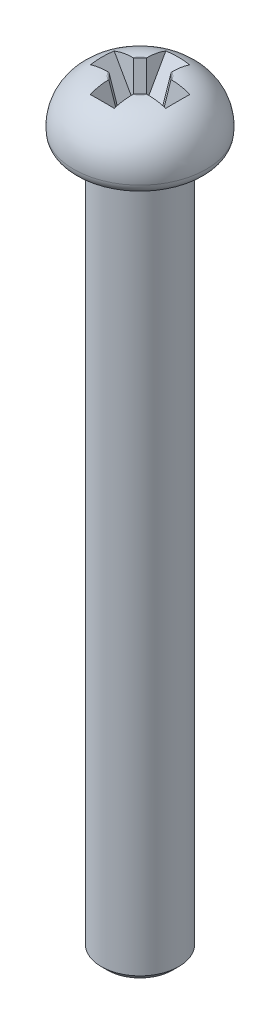
ISO-10303-21;
HEADER;
FILE_DESCRIPTION(('STEP AP214'),'2;1');
FILE_NAME('part.step','',(''),(''),'','','');
FILE_SCHEMA(('AUTOMOTIVE_DESIGN { 1 0 10303 214 1 1 1 1 }'));
ENDSEC;
DATA;
#1=APPLICATION_CONTEXT('core data for automotive mechanical design processes');
#2=APPLICATION_PROTOCOL_DEFINITION('international standard','automotive_design',2000,#1);
#3=PRODUCT_CONTEXT('',#1,'mechanical');
#4=PRODUCT('Part','Part','',(#3));
#5=PRODUCT_RELATED_PRODUCT_CATEGORY('part','',(#4));
#6=PRODUCT_DEFINITION_FORMATION('','',#4);
#7=PRODUCT_DEFINITION_CONTEXT('part definition',#1,'design');
#8=PRODUCT_DEFINITION('design','',#6,#7);
#9=PRODUCT_DEFINITION_SHAPE('','',#8);
#10=(LENGTH_UNIT() NAMED_UNIT(*) SI_UNIT(.MILLI.,.METRE.));
#11=(NAMED_UNIT(*) PLANE_ANGLE_UNIT() SI_UNIT($,.RADIAN.));
#12=(NAMED_UNIT(*) SI_UNIT($,.STERADIAN.) SOLID_ANGLE_UNIT());
#13=UNCERTAINTY_MEASURE_WITH_UNIT(LENGTH_MEASURE(1.E-05),#10,'distance_accuracy_value','');
#14=(GEOMETRIC_REPRESENTATION_CONTEXT(3) GLOBAL_UNCERTAINTY_ASSIGNED_CONTEXT((#13)) GLOBAL_UNIT_ASSIGNED_CONTEXT((#10,
#11,#12)) REPRESENTATION_CONTEXT('',''));
#15=CARTESIAN_POINT('',(0.,0.,0.));
#16=DIRECTION('',(0.,0.,1.));
#17=DIRECTION('',(1.,0.,0.));
#18=AXIS2_PLACEMENT_3D('',#15,#16,#17);
#19=CARTESIAN_POINT('',(0.,23.1,0.));
#20=DIRECTION('',(0.,1.,0.));
#21=DIRECTION('',(-1.,0.,0.));
#22=AXIS2_PLACEMENT_3D('',#19,#20,#21);
#23=DEGENERATE_TOROIDAL_SURFACE('',#22,0.75,1.4,.T.);
#24=CARTESIAN_POINT('',(0.,22.96,0.));
#25=DIRECTION('',(0.,1.,0.));
#26=DIRECTION('',(-1.,0.,0.));
#27=AXIS2_PLACEMENT_3D('',#24,#25,#26);
#28=CIRCLE('',#27,2.14298241194927);
#29=CARTESIAN_POINT('',(-2.14298241194927,22.96,0.));
#30=VERTEX_POINT('',#29);
#31=EDGE_CURVE('E418',#30,#30,#28,.T.);
#32=ORIENTED_EDGE('',*,*,#31,.T.);
#33=EDGE_LOOP('',(#32));
#34=FACE_BOUND('',#33,.T.);
#35=CARTESIAN_POINT('',(0.,24.5,0.));
#36=DIRECTION('',(0.,1.,0.));
#37=DIRECTION('',(-1.,0.,0.));
#38=AXIS2_PLACEMENT_3D('',#35,#36,#37);
#39=CIRCLE('',#38,0.75);
#40=CARTESIAN_POINT('',(0.634428877022475,24.5,-0.400000000000002));
#41=VERTEX_POINT('',#40);
#42=CARTESIAN_POINT('',(0.4,24.5,-0.634428877024973));
#43=VERTEX_POINT('',#42);
#44=EDGE_CURVE('E404',#41,#43,#39,.T.);
#45=ORIENTED_EDGE('',*,*,#44,.F.);
#46=CARTESIAN_POINT('',(-1.3003,24.3626261732546,-0.380375167607794));
#47=CARTESIAN_POINT('',(-1.26089007728644,24.3804122910174,-0.382916041573912));
#48=CARTESIAN_POINT('',(-1.22069162793174,24.3964665213125,-0.385209503044639));
#49=CARTESIAN_POINT('',(-1.13908686700963,24.4250738129891,-0.389296258998438));
#50=CARTESIAN_POINT('',(-1.09768180130337,24.437630353562,-0.391090050508854));
#51=CARTESIAN_POINT('',(-1.0150378123073,24.4589604861164,-0.394137212302335));
#52=CARTESIAN_POINT('',(-0.973822385569127,24.4678236725183,-0.39540338178832));
#53=CARTESIAN_POINT('',(-0.890808141225857,24.4822874948652,-0.397469642123594));
#54=CARTESIAN_POINT('',(-0.849009189432539,24.4878873672845,-0.398269623897777));
#55=CARTESIAN_POINT('',(-0.750413146051571,24.4973555137272,-0.399622216246743));
#56=CARTESIAN_POINT('',(-0.693486317549514,24.4999320449846,-0.39999029214065));
#57=CARTESIAN_POINT('',(-0.608111696236459,24.5000322209244,-0.400004602989195));
#58=CARTESIAN_POINT('',(-0.579643164790398,24.499437049158,-0.399919578451141));
#59=CARTESIAN_POINT('',(-0.522752680185501,24.4971502482129,-0.399592892601835));
#60=CARTESIAN_POINT('',(-0.49433072277346,24.4954587254754,-0.399351246496488));
#61=CARTESIAN_POINT('',(-0.437027740461401,24.4911545469416,-0.398736363848798));
#62=CARTESIAN_POINT('',(-0.408148058124476,24.4885252741714,-0.39836075345306));
#63=CARTESIAN_POINT('',(-0.350439729486661,24.4826832236423,-0.397526174806036));
#64=CARTESIAN_POINT('',(-0.321611108665827,24.4794702094213,-0.397067172774473));
#65=CARTESIAN_POINT('',(-0.264048008426549,24.4729448191823,-0.396134974168897));
#66=CARTESIAN_POINT('',(-0.235313491540051,24.4696327467615,-0.395661820965933));
#67=CARTESIAN_POINT('',(-0.17781808924954,24.4635375284767,-0.394791075496667));
#68=CARTESIAN_POINT('',(-0.149057277636777,24.4607537484653,-0.3943933926379));
#69=CARTESIAN_POINT('',(-0.0905703317910267,24.4563641096998,-0.39376630138569));
#70=CARTESIAN_POINT('',(-0.0608409930125525,24.454795863324,-0.393542266189139));
#71=CARTESIAN_POINT('',(-0.00134528484497124,24.4535218718516,-0.39336026740737));
#72=CARTESIAN_POINT('',(0.0284210707204119,24.4538155668265,-0.393402223832362));
#73=CARTESIAN_POINT('',(0.0879515734934974,24.4561575564786,-0.393736793782651));
#74=CARTESIAN_POINT('',(0.117715515237976,24.4582103943596,-0.394030056337091));
#75=CARTESIAN_POINT('',(0.177148617663195,24.4634038446307,-0.394771977804382));
#76=CARTESIAN_POINT('',(0.206817733981497,24.4665449072044,-0.395220701029198));
#77=CARTESIAN_POINT('',(0.266166782746956,24.4731383852877,-0.396162626469666));
#78=CARTESIAN_POINT('',(0.295846655084594,24.4765912961258,-0.396655899446544));
#79=CARTESIAN_POINT('',(0.355237360185876,24.4831693402262,-0.397595620032309));
#80=CARTESIAN_POINT('',(0.384948182602501,24.4862945605132,-0.398042080073309));
#81=CARTESIAN_POINT('',(0.444392003324856,24.4917606922595,-0.398822956037075));
#82=CARTESIAN_POINT('',(0.474124858325947,24.4941030474649,-0.399157578209268));
#83=CARTESIAN_POINT('',(0.533656079386098,24.4977057923504,-0.399672256050055));
#84=CARTESIAN_POINT('',(0.563454442779347,24.4989662252703,-0.399852317895754));
#85=CARTESIAN_POINT('',(0.652518321779543,24.5007832672825,-0.400111895326074));
#86=CARTESIAN_POINT('',(0.711846078503662,24.4994180674973,-0.399916866785334));
#87=CARTESIAN_POINT('',(0.830130248041174,24.4905767975484,-0.398653828221197));
#88=CARTESIAN_POINT('',(0.889086074613947,24.4830927480587,-0.3975846782941));
#89=CARTESIAN_POINT('',(1.00818018951245,24.4611596619974,-0.394451380285342));
#90=CARTESIAN_POINT('',(1.06826824121651,24.4464383162736,-0.392348330896228));
#91=CARTESIAN_POINT('',(1.18620618717689,24.4098804005745,-0.387125771510653));
#92=CARTESIAN_POINT('',(1.24405541021776,24.388041714981,-0.384005959283004));
#93=CARTESIAN_POINT('',(1.3003,24.3626261732546,-0.380375167607803));
#94=B_SPLINE_CURVE_WITH_KNOTS('',3,(#46,#47,#48,#49,#50,#51,#52,#53,#54,#55,#56,#57,#58,#59,#60,
#61,#62,#63,#64,#65,#66,#67,#68,#69,#70,#71,#72,#73,#74,#75,#76,#77,#78,#79,#80,#81,#82,#83,#84,
#85,#86,#87,#88,#89,#90,#91,#92,#93),.UNSPECIFIED.,.F.,.F.,(4,2,2,2,2,2,2,2,2,2,2,2,2,2,2,2,2,2,
2,2,2,2,2,4),(0.,0.129882661764058,0.259635662633353,0.386026440923431,0.512446779319048,
0.683107501657639,0.768515489142608,0.853915185871134,0.940910193949357,1.02794052084929,
1.11472701876279,1.20140867239522,1.29067590426618,1.37991629270354,1.46938785248041,
1.55889646970851,1.64854984727201,1.73817935495753,1.82764264548264,1.91710236038141,
2.09483807436349,2.27280593614925,2.45805157898703,2.6433523361058),.UNSPECIFIED.);
#95=CARTESIAN_POINT('',(1.21872132087533,24.3965544083868,-0.385222058340974));
#96=VERTEX_POINT('',#95);
#97=EDGE_CURVE('E531',#41,#96,#94,.T.);
#98=ORIENTED_EDGE('',*,*,#97,.T.);
#99=CARTESIAN_POINT('',(1.21758280761715,24.3951053915127,0.400299999999995));
#100=CARTESIAN_POINT('',(1.22268436967021,24.4015982886712,0.333794911276537));
#101=CARTESIAN_POINT('',(1.22643888664972,24.4063767648269,0.267039035884157));
#102=CARTESIAN_POINT('',(1.23138366522483,24.4126701193771,0.13352149792124));
#103=CARTESIAN_POINT('',(1.23258325242981,24.4141968667289,0.0667607489606173));
#104=CARTESIAN_POINT('',(1.23258325242981,24.4141968667289,-0.0667607489606272));
#105=CARTESIAN_POINT('',(1.23138366522483,24.4126701193771,-0.133521497921249));
#106=CARTESIAN_POINT('',(1.22643888664972,24.4063767648269,-0.267039035884167));
#107=CARTESIAN_POINT('',(1.2226843696702,24.4015982886712,-0.333794911276547));
#108=CARTESIAN_POINT('',(1.21758280761715,24.3951053915127,-0.400300000000005));
#109=B_SPLINE_CURVE_WITH_KNOTS('',3,(#99,#100,#101,#102,#103,#104,#105,#106,#107,#108),
.UNSPECIFIED.,.F.,.F.,(4,2,2,2,4),(0.,0.200980856434186,0.40122685746795,0.601472858501713,
0.802453714935899),.UNSPECIFIED.);
#110=CARTESIAN_POINT('',(1.21872132087533,24.3965544083868,0.385222058340965));
#111=VERTEX_POINT('',#110);
#112=EDGE_CURVE('E522',#111,#96,#109,.T.);
#113=ORIENTED_EDGE('',*,*,#112,.F.);
#114=CARTESIAN_POINT('',(1.3003,24.3626261732546,0.380375167607794));
#115=CARTESIAN_POINT('',(1.26089007728643,24.3804122910174,0.382916041573911));
#116=CARTESIAN_POINT('',(1.22069162793174,24.3964665213125,0.385209503044639));
#117=CARTESIAN_POINT('',(1.13908686700963,24.4250738129891,0.389296258998437));
#118=CARTESIAN_POINT('',(1.09768180130337,24.437630353562,0.391090050508854));
#119=CARTESIAN_POINT('',(1.0150378123073,24.4589604861164,0.394137212302334));
#120=CARTESIAN_POINT('',(0.973822385569129,24.4678236725183,0.395403381788319));
#121=CARTESIAN_POINT('',(0.89080814122586,24.4822874948652,0.397469642123592));
#122=CARTESIAN_POINT('',(0.849009189432542,24.4878873672845,0.398269623897776));
#123=CARTESIAN_POINT('',(0.750413146051575,24.4973555137272,0.399622216246743));
#124=CARTESIAN_POINT('',(0.693486317549516,24.4999320449846,0.399990292140649));
#125=CARTESIAN_POINT('',(0.60811169623646,24.5000322209244,0.400004602989195));
#126=CARTESIAN_POINT('',(0.579643164790399,24.499437049158,0.39991957845114));
#127=CARTESIAN_POINT('',(0.522752680185501,24.4971502482129,0.399592892601834));
#128=CARTESIAN_POINT('',(0.49433072277346,24.4954587254754,0.399351246496487));
#129=CARTESIAN_POINT('',(0.4370277404614,24.4911545469416,0.398736363848797));
#130=CARTESIAN_POINT('',(0.408148058124473,24.4885252741714,0.39836075345306));
#131=CARTESIAN_POINT('',(0.350439729486657,24.4826832236423,0.397526174806036));
#132=CARTESIAN_POINT('',(0.321611108665823,24.4794702094213,0.397067172774473));
#133=CARTESIAN_POINT('',(0.264048008426544,24.4729448191823,0.396134974168897));
#134=CARTESIAN_POINT('',(0.235313491540045,24.4696327467615,0.395661820965933));
#135=CARTESIAN_POINT('',(0.177818089249534,24.4635375284767,0.394791075496667));
#136=CARTESIAN_POINT('',(0.14905727763677,24.4607537484653,0.3943933926379));
#137=CARTESIAN_POINT('',(0.0905703317910196,24.4563641096998,0.393766301385689));
#138=CARTESIAN_POINT('',(0.0608409930125457,24.454795863324,0.393542266189138));
#139=CARTESIAN_POINT('',(0.00134528484496484,24.4535218718516,0.39336026740737));
#140=CARTESIAN_POINT('',(-0.0284210707204181,24.4538155668265,0.393402223832361));
#141=CARTESIAN_POINT('',(-0.0879515734935034,24.4561575564786,0.393736793782651));
#142=CARTESIAN_POINT('',(-0.117715515237982,24.4582103943596,0.394030056337091));
#143=CARTESIAN_POINT('',(-0.177148617663201,24.4634038446307,0.394771977804381));
#144=CARTESIAN_POINT('',(-0.206817733981503,24.4665449072044,0.395220701029197));
#145=CARTESIAN_POINT('',(-0.266166782746961,24.4731383852877,0.396162626469665));
#146=CARTESIAN_POINT('',(-0.2958466550846,24.4765912961258,0.396655899446543));
#147=CARTESIAN_POINT('',(-0.355237360185881,24.4831693402262,0.397595620032309));
#148=CARTESIAN_POINT('',(-0.384948182602506,24.4862945605132,0.398042080073309));
#149=CARTESIAN_POINT('',(-0.44439200332486,24.4917606922595,0.398822956037074));
#150=CARTESIAN_POINT('',(-0.474124858325951,24.4941030474649,0.399157578209267));
#151=CARTESIAN_POINT('',(-0.533656079386102,24.4977057923504,0.399672256050054));
#152=CARTESIAN_POINT('',(-0.563454442779351,24.4989662252703,0.399852317895753));
#153=CARTESIAN_POINT('',(-0.652518321779546,24.5007832672825,0.400111895326074));
#154=CARTESIAN_POINT('',(-0.711846078503665,24.4994180674973,0.399916866785333));
#155=CARTESIAN_POINT('',(-0.830130248041177,24.4905767975484,0.398653828221196));
#156=CARTESIAN_POINT('',(-0.88908607461395,24.4830927480587,0.3975846782941));
#157=CARTESIAN_POINT('',(-1.00818018951245,24.4611596619974,0.394451380285341));
#158=CARTESIAN_POINT('',(-1.06826824121651,24.4464383162736,0.392348330896227));
#159=CARTESIAN_POINT('',(-1.18620618717689,24.4098804005745,0.387125771510651));
#160=CARTESIAN_POINT('',(-1.24405541021776,24.388041714981,0.384005959283003));
#161=CARTESIAN_POINT('',(-1.3003,24.3626261732546,0.380375167607802));
#162=B_SPLINE_CURVE_WITH_KNOTS('',3,(#114,#115,#116,#117,#118,#119,#120,#121,#122,#123,#124,
#125,#126,#127,#128,#129,#130,#131,#132,#133,#134,#135,#136,#137,#138,#139,#140,#141,#142,#143,
#144,#145,#146,#147,#148,#149,#150,#151,#152,#153,#154,#155,#156,#157,#158,#159,#160,#161),
.UNSPECIFIED.,.F.,.F.,(4,2,2,2,2,2,2,2,2,2,2,2,2,2,2,2,2,2,2,2,2,2,2,4),(0.,0.129882661764057,
0.259635662633351,0.386026440923427,0.512446779319042,0.683107501657636,0.768515489142607,
0.853915185871135,0.940910193949359,1.0279405208493,1.1147270187628,1.20140867239523,
1.29067590426619,1.37991629270355,1.46938785248042,1.55889646970851,1.64854984727201,
1.73817935495753,1.82764264548264,1.91710236038142,2.09483807436349,2.27280593614925,
2.45805157898703,2.6433523361058),.UNSPECIFIED.);
#163=CARTESIAN_POINT('',(0.634428877022478,24.5,0.399999999999998));
#164=VERTEX_POINT('',#163);
#165=EDGE_CURVE('E469',#111,#164,#162,.T.);
#166=ORIENTED_EDGE('',*,*,#165,.T.);
#167=CARTESIAN_POINT('',(0.399999999999999,24.5,0.634428877021819));
#168=VERTEX_POINT('',#167);
#169=EDGE_CURVE('E412',#168,#164,#39,.T.);
#170=ORIENTED_EDGE('',*,*,#169,.F.);
#171=CARTESIAN_POINT('',(0.380375167607798,24.3626261732546,-1.3003));
#172=CARTESIAN_POINT('',(0.382916041573916,24.3804122910174,-1.26089007728643));
#173=CARTESIAN_POINT('',(0.385209503044644,24.3964665213125,-1.22069162793174));
#174=CARTESIAN_POINT('',(0.389296258998442,24.4250738129891,-1.13908686700963));
#175=CARTESIAN_POINT('',(0.391090050508857,24.437630353562,-1.09768180130337));
#176=CARTESIAN_POINT('',(0.394137212302338,24.4589604861164,-1.0150378123073));
#177=CARTESIAN_POINT('',(0.395403381788323,24.4678236725183,-0.973822385569125));
#178=CARTESIAN_POINT('',(0.397469642123596,24.4822874948652,-0.890808141225855));
#179=CARTESIAN_POINT('',(0.398269623897779,24.4878873672845,-0.849009189432537));
#180=CARTESIAN_POINT('',(0.399622216246745,24.4973555137272,-0.750413146051569));
#181=CARTESIAN_POINT('',(0.399990292140652,24.4999320449846,-0.693486317549512));
#182=CARTESIAN_POINT('',(0.400004602989198,24.5000322209244,-0.608111696236457));
#183=CARTESIAN_POINT('',(0.399919578451143,24.499437049158,-0.579643164790396));
#184=CARTESIAN_POINT('',(0.399592892601837,24.4971502482129,-0.5227526801855));
#185=CARTESIAN_POINT('',(0.39935124649649,24.4954587254754,-0.494330722773459));
#186=CARTESIAN_POINT('',(0.398736363848799,24.4911545469416,-0.4370277404614));
#187=CARTESIAN_POINT('',(0.398360753453061,24.4885252741714,-0.408148058124474));
#188=CARTESIAN_POINT('',(0.397526174806037,24.4826832236423,-0.350439729486659));
#189=CARTESIAN_POINT('',(0.397067172774475,24.4794702094213,-0.321611108665825));
#190=CARTESIAN_POINT('',(0.396134974168899,24.4729448191823,-0.264048008426547));
#191=CARTESIAN_POINT('',(0.395661820965934,24.4696327467615,-0.235313491540049));
#192=CARTESIAN_POINT('',(0.394791075496668,24.4635375284767,-0.177818089249539));
#193=CARTESIAN_POINT('',(0.394393392637901,24.4607537484653,-0.149057277636776));
#194=CARTESIAN_POINT('',(0.39376630138569,24.4563641096998,-0.0905703317910256));
#195=CARTESIAN_POINT('',(0.393542266189139,24.454795863324,-0.0608409930125514));
#196=CARTESIAN_POINT('',(0.39336026740737,24.4535218718516,-0.00134528484497017));
#197=CARTESIAN_POINT('',(0.393402223832362,24.4538155668265,0.028421070720413));
#198=CARTESIAN_POINT('',(0.393736793782651,24.4561575564786,0.0879515734934985));
#199=CARTESIAN_POINT('',(0.394030056337091,24.4582103943596,0.117715515237977));
#200=CARTESIAN_POINT('',(0.394771977804381,24.4634038446307,0.177148617663196));
#201=CARTESIAN_POINT('',(0.395220701029197,24.4665449072044,0.206817733981498));
#202=CARTESIAN_POINT('',(0.396162626469665,24.4731383852877,0.266166782746957));
#203=CARTESIAN_POINT('',(0.396655899446543,24.4765912961258,0.295846655084596));
#204=CARTESIAN_POINT('',(0.397595620032308,24.4831693402262,0.355237360185877));
#205=CARTESIAN_POINT('',(0.398042080073308,24.4862945605132,0.384948182602502));
#206=CARTESIAN_POINT('',(0.398822956037074,24.4917606922595,0.444392003324857));
#207=CARTESIAN_POINT('',(0.399157578209267,24.4941030474649,0.474124858325948));
#208=CARTESIAN_POINT('',(0.399672256050053,24.4977057923504,0.533656079386099));
#209=CARTESIAN_POINT('',(0.399852317895752,24.4989662252703,0.563454442779348));
#210=CARTESIAN_POINT('',(0.400111895326072,24.5007832672825,0.652518321779544));
#211=CARTESIAN_POINT('',(0.399916866785332,24.4994180674973,0.711846078503663));
#212=CARTESIAN_POINT('',(0.398653828221194,24.4905767975484,0.830130248041175));
#213=CARTESIAN_POINT('',(0.397584678294097,24.4830927480587,0.889086074613948));
#214=CARTESIAN_POINT('',(0.394451380285338,24.4611596619974,1.00818018951245));
#215=CARTESIAN_POINT('',(0.392348330896224,24.4464383162736,1.06826824121651));
#216=CARTESIAN_POINT('',(0.387125771510649,24.4098804005745,1.18620618717689));
#217=CARTESIAN_POINT('',(0.384005959283,24.388041714981,1.24405541021776));
#218=CARTESIAN_POINT('',(0.380375167607799,24.3626261732546,1.3003));
#219=B_SPLINE_CURVE_WITH_KNOTS('',3,(#171,#172,#173,#174,#175,#176,#177,#178,#179,#180,#181,
#182,#183,#184,#185,#186,#187,#188,#189,#190,#191,#192,#193,#194,#195,#196,#197,#198,#199,#200,
#201,#202,#203,#204,#205,#206,#207,#208,#209,#210,#211,#212,#213,#214,#215,#216,#217,#218),
.UNSPECIFIED.,.F.,.F.,(4,2,2,2,2,2,2,2,2,2,2,2,2,2,2,2,2,2,2,2,2,2,2,4),(0.,0.129882661764059,
0.259635662633354,0.386026440923432,0.512446779319048,0.683107501657639,0.768515489142608,
0.853915185871134,0.940910193949357,1.02794052084929,1.11472701876279,1.20140867239522,
1.29067590426618,1.37991629270354,1.46938785248041,1.55889646970851,1.64854984727201,
1.73817935495753,1.82764264548264,1.91710236038142,2.09483807436349,2.27280593614925,
2.45805157898703,2.6433523361058),.UNSPECIFIED.);
#220=CARTESIAN_POINT('',(0.38522205834097,24.3965544083868,1.21872132087533));
#221=VERTEX_POINT('',#220);
#222=EDGE_CURVE('E288',#168,#221,#219,.T.);
#223=ORIENTED_EDGE('',*,*,#222,.T.);
#224=CARTESIAN_POINT('',(-0.4003,24.3951053915127,1.21758280761715));
#225=CARTESIAN_POINT('',(-0.333794911276542,24.4015982886712,1.22268436967021));
#226=CARTESIAN_POINT('',(-0.267039035884161,24.4063767648269,1.22643888664972));
#227=CARTESIAN_POINT('',(-0.133521497921244,24.4126701193771,1.23138366522483));
#228=CARTESIAN_POINT('',(-0.0667607489606219,24.4141968667289,1.23258325242981));
#229=CARTESIAN_POINT('',(0.0667607489606226,24.4141968667289,1.23258325242981));
#230=CARTESIAN_POINT('',(0.133521497921245,24.4126701193771,1.23138366522483));
#231=CARTESIAN_POINT('',(0.267039035884162,24.4063767648269,1.22643888664972));
#232=CARTESIAN_POINT('',(0.333794911276542,24.4015982886712,1.22268436967021));
#233=CARTESIAN_POINT('',(0.400300000000001,24.3951053915127,1.21758280761715));
#234=B_SPLINE_CURVE_WITH_KNOTS('',3,(#224,#225,#226,#227,#228,#229,#230,#231,#232,#233),
.UNSPECIFIED.,.F.,.F.,(4,2,2,2,4),(0.,0.200980856434186,0.40122685746795,0.601472858501713,
0.802453714935899),.UNSPECIFIED.);
#235=CARTESIAN_POINT('',(-0.385222058340969,24.3965544083868,1.21872132087533));
#236=VERTEX_POINT('',#235);
#237=EDGE_CURVE('E388',#236,#221,#234,.T.);
#238=ORIENTED_EDGE('',*,*,#237,.F.);
#239=CARTESIAN_POINT('',(-0.380375167607798,24.3626261732546,1.3003));
#240=CARTESIAN_POINT('',(-0.382916041573916,24.3804122910174,1.26089007728643));
#241=CARTESIAN_POINT('',(-0.385209503044643,24.3964665213125,1.22069162793174));
#242=CARTESIAN_POINT('',(-0.389296258998441,24.4250738129891,1.13908686700963));
#243=CARTESIAN_POINT('',(-0.391090050508857,24.437630353562,1.09768180130337));
#244=CARTESIAN_POINT('',(-0.394137212302337,24.4589604861164,1.0150378123073));
#245=CARTESIAN_POINT('',(-0.395403381788323,24.4678236725183,0.973822385569126));
#246=CARTESIAN_POINT('',(-0.397469642123596,24.4822874948652,0.890808141225857));
#247=CARTESIAN_POINT('',(-0.398269623897779,24.4878873672845,0.849009189432539));
#248=CARTESIAN_POINT('',(-0.399622216246745,24.4973555137272,0.750413146051571));
#249=CARTESIAN_POINT('',(-0.399990292140652,24.4999320449846,0.693486317549512));
#250=CARTESIAN_POINT('',(-0.400004602989197,24.5000322209244,0.608111696236456));
#251=CARTESIAN_POINT('',(-0.399919578451143,24.499437049158,0.579643164790395));
#252=CARTESIAN_POINT('',(-0.399592892601836,24.4971502482129,0.522752680185497));
#253=CARTESIAN_POINT('',(-0.399351246496488,24.4954587254754,0.494330722773456));
#254=CARTESIAN_POINT('',(-0.398736363848798,24.4911545469416,0.437027740461396));
#255=CARTESIAN_POINT('',(-0.398360753453061,24.4885252741714,0.40814805812447));
#256=CARTESIAN_POINT('',(-0.397526174806036,24.4826832236423,0.350439729486654));
#257=CARTESIAN_POINT('',(-0.397067172774473,24.4794702094213,0.32161110866582));
#258=CARTESIAN_POINT('',(-0.396134974168898,24.4729448191823,0.26404800842654));
#259=CARTESIAN_POINT('',(-0.395661820965934,24.4696327467615,0.235313491540042));
#260=CARTESIAN_POINT('',(-0.394791075496668,24.4635375284767,0.177818089249531));
#261=CARTESIAN_POINT('',(-0.3943933926379,24.4607537484653,0.149057277636767));
#262=CARTESIAN_POINT('',(-0.393766301385689,24.4563641096998,0.0905703317910167));
#263=CARTESIAN_POINT('',(-0.393542266189138,24.454795863324,0.0608409930125426));
#264=CARTESIAN_POINT('',(-0.39336026740737,24.4535218718516,0.00134528484496143));
#265=CARTESIAN_POINT('',(-0.393402223832361,24.4538155668265,-0.0284210707204217));
#266=CARTESIAN_POINT('',(-0.393736793782651,24.4561575564786,-0.0879515734935071));
#267=CARTESIAN_POINT('',(-0.39403005633709,24.4582103943596,-0.117715515237985));
#268=CARTESIAN_POINT('',(-0.394771977804381,24.4634038446307,-0.177148617663205));
#269=CARTESIAN_POINT('',(-0.395220701029196,24.4665449072044,-0.206817733981507));
#270=CARTESIAN_POINT('',(-0.396162626469664,24.4731383852877,-0.266166782746965));
#271=CARTESIAN_POINT('',(-0.396655899446542,24.4765912961258,-0.295846655084604));
#272=CARTESIAN_POINT('',(-0.397595620032308,24.4831693402262,-0.355237360185884));
#273=CARTESIAN_POINT('',(-0.398042080073307,24.4862945605132,-0.384948182602509));
#274=CARTESIAN_POINT('',(-0.398822956037073,24.4917606922595,-0.444392003324864));
#275=CARTESIAN_POINT('',(-0.399157578209265,24.4941030474649,-0.474124858325955));
#276=CARTESIAN_POINT('',(-0.399672256050052,24.4977057923504,-0.533656079386105));
#277=CARTESIAN_POINT('',(-0.399852317895752,24.4989662252703,-0.563454442779355));
#278=CARTESIAN_POINT('',(-0.400111895326072,24.5007832672825,-0.65251832177955));
#279=CARTESIAN_POINT('',(-0.399916866785331,24.4994180674973,-0.711846078503668));
#280=CARTESIAN_POINT('',(-0.398653828221193,24.4905767975484,-0.83013024804118));
#281=CARTESIAN_POINT('',(-0.397584678294096,24.4830927480587,-0.889086074613953));
#282=CARTESIAN_POINT('',(-0.394451380285338,24.4611596619974,-1.00818018951245));
#283=CARTESIAN_POINT('',(-0.392348330896223,24.4464383162736,-1.06826824121651));
#284=CARTESIAN_POINT('',(-0.387125771510647,24.4098804005745,-1.1862061871769));
#285=CARTESIAN_POINT('',(-0.384005959282999,24.388041714981,-1.24405541021776));
#286=CARTESIAN_POINT('',(-0.380375167607798,24.3626261732546,-1.3003));
#287=B_SPLINE_CURVE_WITH_KNOTS('',3,(#239,#240,#241,#242,#243,#244,#245,#246,#247,#248,#249,
#250,#251,#252,#253,#254,#255,#256,#257,#258,#259,#260,#261,#262,#263,#264,#265,#266,#267,#268,
#269,#270,#271,#272,#273,#274,#275,#276,#277,#278,#279,#280,#281,#282,#283,#284,#285,#286),
.UNSPECIFIED.,.F.,.F.,(4,2,2,2,2,2,2,2,2,2,2,2,2,2,2,2,2,2,2,2,2,2,2,4),(0.,0.129882661764057,
0.259635662633351,0.386026440923429,0.512446779319045,0.683107501657639,0.76851548914261,
0.853915185871137,0.940910193949361,1.0279405208493,1.1147270187628,1.20140867239523,
1.29067590426619,1.37991629270355,1.46938785248042,1.55889646970851,1.64854984727202,
1.73817935495753,1.82764264548265,1.91710236038142,2.09483807436349,2.27280593614926,
2.45805157898703,2.6433523361058),.UNSPECIFIED.);
#288=CARTESIAN_POINT('',(-0.399999999999999,24.5,0.634428877024973));
#289=VERTEX_POINT('',#288);
#290=EDGE_CURVE('E453',#236,#289,#287,.T.);
#291=ORIENTED_EDGE('',*,*,#290,.T.);
#292=CARTESIAN_POINT('',(-0.634428877022475,24.5,0.400000000000002));
#293=VERTEX_POINT('',#292);
#294=EDGE_CURVE('E287',#293,#289,#39,.T.);
#295=ORIENTED_EDGE('',*,*,#294,.F.);
#296=CARTESIAN_POINT('',(-1.21872132087533,24.3965544083868,0.385222058340974));
#297=VERTEX_POINT('',#296);
#298=EDGE_CURVE('E345',#293,#297,#162,.T.);
#299=ORIENTED_EDGE('',*,*,#298,.T.);
#300=CARTESIAN_POINT('',(-1.21758280761715,24.3951053915127,-0.400299999999996));
#301=CARTESIAN_POINT('',(-1.22268436967021,24.4015982886712,-0.333794911276538));
#302=CARTESIAN_POINT('',(-1.22643888664973,24.4063767648269,-0.267039035884157));
#303=CARTESIAN_POINT('',(-1.23138366522484,24.4126701193771,-0.13352149792124));
#304=CARTESIAN_POINT('',(-1.23258325242982,24.4141968667289,-0.0667607489606179));
#305=CARTESIAN_POINT('',(-1.23258325242982,24.4141968667289,0.0667607489606265));
#306=CARTESIAN_POINT('',(-1.23138366522484,24.4126701193771,0.133521497921249));
#307=CARTESIAN_POINT('',(-1.22643888664973,24.4063767648269,0.267039035884166));
#308=CARTESIAN_POINT('',(-1.22268436967021,24.4015982886712,0.333794911276546));
#309=CARTESIAN_POINT('',(-1.21758280761715,24.3951053915127,0.400300000000004));
#310=B_SPLINE_CURVE_WITH_KNOTS('',3,(#300,#301,#302,#303,#304,#305,#306,#307,#308,#309),
.UNSPECIFIED.,.F.,.F.,(4,2,2,2,4),(0.,0.200980856434186,0.40122685746795,0.601472858501713,
0.802453714935899),.UNSPECIFIED.);
#311=CARTESIAN_POINT('',(-1.21872132087533,24.3965544083868,-0.385222058340965));
#312=VERTEX_POINT('',#311);
#313=EDGE_CURVE('E472',#312,#297,#310,.T.);
#314=ORIENTED_EDGE('',*,*,#313,.F.);
#315=CARTESIAN_POINT('',(-0.634428877022478,24.5,-0.399999999999998));
#316=VERTEX_POINT('',#315);
#317=EDGE_CURVE('E527',#312,#316,#94,.T.);
#318=ORIENTED_EDGE('',*,*,#317,.T.);
#319=CARTESIAN_POINT('',(-0.399999999999999,24.5,-0.634428877021819));
#320=VERTEX_POINT('',#319);
#321=EDGE_CURVE('E401',#320,#316,#39,.T.);
#322=ORIENTED_EDGE('',*,*,#321,.F.);
#323=CARTESIAN_POINT('',(-0.385222058340969,24.3965544083868,-1.21872132087533));
#324=VERTEX_POINT('',#323);
#325=EDGE_CURVE('E277',#320,#324,#287,.T.);
#326=ORIENTED_EDGE('',*,*,#325,.T.);
#327=CARTESIAN_POINT('',(0.4003,24.3951053915127,-1.21758280761715));
#328=CARTESIAN_POINT('',(0.333794911276542,24.4015982886712,-1.22268436967021));
#329=CARTESIAN_POINT('',(0.267039035884162,24.4063767648269,-1.22643888664973));
#330=CARTESIAN_POINT('',(0.133521497921245,24.4126701193771,-1.23138366522484));
#331=CARTESIAN_POINT('',(0.0667607489606224,24.4141968667289,-1.23258325242981));
#332=CARTESIAN_POINT('',(-0.0667607489606221,24.4141968667289,-1.23258325242981));
#333=CARTESIAN_POINT('',(-0.133521497921244,24.4126701193771,-1.23138366522484));
#334=CARTESIAN_POINT('',(-0.267039035884161,24.4063767648269,-1.22643888664973));
#335=CARTESIAN_POINT('',(-0.333794911276542,24.4015982886712,-1.22268436967021));
#336=CARTESIAN_POINT('',(-0.4003,24.3951053915127,-1.21758280761715));
#337=B_SPLINE_CURVE_WITH_KNOTS('',3,(#327,#328,#329,#330,#331,#332,#333,#334,#335,#336),
.UNSPECIFIED.,.F.,.F.,(4,2,2,2,4),(0.,0.200980856434186,0.40122685746795,0.601472858501713,
0.802453714935899),.UNSPECIFIED.);
#338=CARTESIAN_POINT('',(0.38522205834097,24.3965544083868,-1.21872132087533));
#339=VERTEX_POINT('',#338);
#340=EDGE_CURVE('E310',#339,#324,#337,.T.);
#341=ORIENTED_EDGE('',*,*,#340,.F.);
#342=EDGE_CURVE('E279',#339,#43,#219,.T.);
#343=ORIENTED_EDGE('',*,*,#342,.T.);
#344=EDGE_LOOP('',(#45,#98,#113,#166,#170,#223,#238,#291,#295,#299,#314,#318,#322,#326,#341,#343));
#345=FACE_BOUND('',#344,.T.);
#346=ADVANCED_FACE('F49',(#34,#345),#23,.T.);
#347=CARTESIAN_POINT('',(0.,24.5,0.));
#348=DIRECTION('',(0.,1.,0.));
#349=DIRECTION('',(-1.,0.,0.));
#350=AXIS2_PLACEMENT_3D('',#347,#348,#349);
#351=PLANE('',#350);
#352=DIRECTION('',(0.,0.,1.));
#353=VECTOR('',#352,1.);
#354=CARTESIAN_POINT('',(0.399999999999999,24.5,0.));
#355=LINE('',#354,#353);
#356=CARTESIAN_POINT('',(0.399999999999999,24.5,-0.606154422220003));
#357=VERTEX_POINT('',#356);
#358=EDGE_CURVE('E398',#43,#357,#355,.T.);
#359=ORIENTED_EDGE('',*,*,#358,.T.);
#360=DIRECTION('',(-0.699855700150238,0.,-0.714284256418423));
#361=VECTOR('',#360,1.);
#362=CARTESIAN_POINT('',(0.507094915102327,24.5,-0.49685158767334));
#363=LINE('',#362,#361);
#364=CARTESIAN_POINT('',(0.601990098767246,24.5,-0.400000000000002));
#365=VERTEX_POINT('',#364);
#366=EDGE_CURVE('E375',#357,#365,#363,.F.);
#367=ORIENTED_EDGE('',*,*,#366,.T.);
#368=DIRECTION('',(-1.,0.,0.));
#369=VECTOR('',#368,1.);
#370=CARTESIAN_POINT('',(1.3,24.5,-0.400000000000005));
#371=LINE('',#370,#369);
#372=EDGE_CURVE('E347',#41,#365,#371,.T.);
#373=ORIENTED_EDGE('',*,*,#372,.F.);
#374=ORIENTED_EDGE('',*,*,#44,.T.);
#375=EDGE_LOOP('',(#359,#367,#373,#374));
#376=FACE_BOUND('',#375,.T.);
#377=ADVANCED_FACE('F423',(#376),#351,.T.);
#378=DIRECTION('',(1.,0.,0.));
#379=VECTOR('',#378,1.);
#380=CARTESIAN_POINT('',(1.3,24.5,0.399999999999995));
#381=LINE('',#380,#379);
#382=CARTESIAN_POINT('',(0.601990098767249,24.5,0.399999999999998));
#383=VERTEX_POINT('',#382);
#384=EDGE_CURVE('E346',#383,#164,#381,.T.);
#385=ORIENTED_EDGE('',*,*,#384,.F.);
#386=DIRECTION('',(0.699855700150233,0.,-0.714284256418428));
#387=VECTOR('',#386,1.);
#388=CARTESIAN_POINT('',(0.507094915102331,24.5,0.496851587673336));
#389=LINE('',#388,#387);
#390=CARTESIAN_POINT('',(0.399999999999999,24.5,0.606154422220005));
#391=VERTEX_POINT('',#390);
#392=EDGE_CURVE('E363',#383,#391,#389,.F.);
#393=ORIENTED_EDGE('',*,*,#392,.T.);
#394=EDGE_CURVE('E397',#391,#168,#355,.T.);
#395=ORIENTED_EDGE('',*,*,#394,.T.);
#396=ORIENTED_EDGE('',*,*,#169,.T.);
#397=EDGE_LOOP('',(#385,#393,#395,#396));
#398=FACE_BOUND('',#397,.T.);
#399=ADVANCED_FACE('F590',(#398),#351,.T.);
#400=CARTESIAN_POINT('',(-0.601990098767244,24.5,-0.399999999999998));
#401=VERTEX_POINT('',#400);
#402=EDGE_CURVE('E488',#401,#316,#371,.T.);
#403=ORIENTED_EDGE('',*,*,#402,.F.);
#404=DIRECTION('',(-0.699855700150233,0.,0.714284256418429));
#405=VECTOR('',#404,1.);
#406=CARTESIAN_POINT('',(-0.507094915102329,24.5,-0.496851587673334));
#407=LINE('',#406,#405);
#408=CARTESIAN_POINT('',(-0.399999999999999,24.5,-0.606154422220001));
#409=VERTEX_POINT('',#408);
#410=EDGE_CURVE('E624',#401,#409,#407,.F.);
#411=ORIENTED_EDGE('',*,*,#410,.T.);
#412=DIRECTION('',(0.,0.,1.));
#413=VECTOR('',#412,1.);
#414=CARTESIAN_POINT('',(-0.399999999999999,24.5,0.));
#415=LINE('',#414,#413);
#416=EDGE_CURVE('E380',#409,#320,#415,.F.);
#417=ORIENTED_EDGE('',*,*,#416,.T.);
#418=ORIENTED_EDGE('',*,*,#321,.T.);
#419=EDGE_LOOP('',(#403,#411,#417,#418));
#420=FACE_BOUND('',#419,.T.);
#421=ADVANCED_FACE('F628',(#420),#351,.T.);
#422=CARTESIAN_POINT('',(-0.399999999999999,24.5,0.606154422219992));
#423=VERTEX_POINT('',#422);
#424=EDGE_CURVE('E383',#289,#423,#415,.F.);
#425=ORIENTED_EDGE('',*,*,#424,.T.);
#426=DIRECTION('',(0.699855700150234,0.,0.714284256418428));
#427=VECTOR('',#426,1.);
#428=CARTESIAN_POINT('',(-0.507094915102324,24.5,0.496851587673331));
#429=LINE('',#428,#427);
#430=CARTESIAN_POINT('',(-0.601990098767233,24.5,0.400000000000002));
#431=VERTEX_POINT('',#430);
#432=EDGE_CURVE('E368',#423,#431,#429,.F.);
#433=ORIENTED_EDGE('',*,*,#432,.T.);
#434=EDGE_CURVE('E341',#293,#431,#381,.T.);
#435=ORIENTED_EDGE('',*,*,#434,.F.);
#436=ORIENTED_EDGE('',*,*,#294,.T.);
#437=EDGE_LOOP('',(#425,#433,#435,#436));
#438=FACE_BOUND('',#437,.T.);
#439=ADVANCED_FACE('F299',(#438),#351,.T.);
#440=CARTESIAN_POINT('',(-3.03800000000001,0.434000000000002,0.));
#441=DIRECTION('',(-0.989949493661167,0.14142135623731,0.));
#442=DIRECTION('',(-0.14142135623731,-0.989949493661167,0.));
#443=AXIS2_PLACEMENT_3D('',#440,#441,#442);
#444=PLANE('',#443);
#445=DIRECTION('',(-0.11162911443719,-0.781403801060326,0.613960129404543));
#446=VECTOR('',#445,1.);
#447=CARTESIAN_POINT('',(0.4,24.5,-1.3));
#448=LINE('',#447,#446);
#449=CARTESIAN_POINT('',(0.245812093826667,23.4206846567867,-0.451966516046668));
#450=VERTEX_POINT('',#449);
#451=EDGE_CURVE('E273',#339,#450,#448,.T.);
#452=ORIENTED_EDGE('',*,*,#451,.T.);
#453=DIRECTION('',(0.140028008402801,0.980196058819607,-0.140028008402802));
#454=VECTOR('',#453,1.);
#455=CARTESIAN_POINT('',(-2.98247361612197,0.822684687146282,2.77631919390198));
#456=LINE('',#455,#454);
#457=EDGE_CURVE('E372',#450,#357,#456,.T.);
#458=ORIENTED_EDGE('',*,*,#457,.T.);
#459=ORIENTED_EDGE('',*,*,#358,.F.);
#460=ORIENTED_EDGE('',*,*,#342,.F.);
#461=EDGE_LOOP('',(#452,#458,#459,#460));
#462=FACE_BOUND('',#461,.T.);
#463=ADVANCED_FACE('F293',(#462),#444,.T.);
#464=ORIENTED_EDGE('',*,*,#394,.F.);
#465=DIRECTION('',(-0.140028008402801,-0.980196058819607,-0.1400280084028));
#466=VECTOR('',#465,1.);
#467=CARTESIAN_POINT('',(-2.98247361612197,0.822684687146273,-2.77631919390194));
#468=LINE('',#467,#466);
#469=CARTESIAN_POINT('',(0.245812093826668,23.4206846567867,0.451966516046674));
#470=VERTEX_POINT('',#469);
#471=EDGE_CURVE('E360',#391,#470,#468,.T.);
#472=ORIENTED_EDGE('',*,*,#471,.T.);
#473=DIRECTION('',(-0.11162911443719,-0.781403801060326,-0.613960129404542));
#474=VECTOR('',#473,1.);
#475=CARTESIAN_POINT('',(0.4,24.5,1.3));
#476=LINE('',#475,#474);
#477=EDGE_CURVE('E278',#221,#470,#476,.T.);
#478=ORIENTED_EDGE('',*,*,#477,.F.);
#479=ORIENTED_EDGE('',*,*,#222,.F.);
#480=EDGE_LOOP('',(#464,#472,#478,#479));
#481=FACE_BOUND('',#480,.T.);
#482=ADVANCED_FACE('F298',(#481),#444,.T.);
#483=CARTESIAN_POINT('',(3.038,0.434,0.));
#484=DIRECTION('',(0.989949493661167,0.141421356237309,0.));
#485=DIRECTION('',(-0.141421356237309,0.989949493661167,0.));
#486=AXIS2_PLACEMENT_3D('',#483,#484,#485);
#487=PLANE('',#486);
#488=ORIENTED_EDGE('',*,*,#416,.F.);
#489=DIRECTION('',(0.140028008402801,-0.980196058819607,0.140028008402801));
#490=VECTOR('',#489,1.);
#491=CARTESIAN_POINT('',(2.98247361612196,0.822684687146273,2.77631919390196));
#492=LINE('',#491,#490);
#493=CARTESIAN_POINT('',(-0.245812093826667,23.4206846567867,-0.451966516046669));
#494=VERTEX_POINT('',#493);
#495=EDGE_CURVE('E379',#409,#494,#492,.T.);
#496=ORIENTED_EDGE('',*,*,#495,.T.);
#497=DIRECTION('',(0.111629114437189,-0.781403801060326,0.613960129404543));
#498=VECTOR('',#497,1.);
#499=CARTESIAN_POINT('',(-0.4,24.5,-1.3));
#500=LINE('',#499,#498);
#501=EDGE_CURVE('E205',#324,#494,#500,.T.);
#502=ORIENTED_EDGE('',*,*,#501,.F.);
#503=ORIENTED_EDGE('',*,*,#325,.F.);
#504=EDGE_LOOP('',(#488,#496,#502,#503));
#505=FACE_BOUND('',#504,.T.);
#506=ADVANCED_FACE('F234',(#505),#487,.T.);
#507=DIRECTION('',(0.111629114437189,-0.781403801060326,-0.613960129404542));
#508=VECTOR('',#507,1.);
#509=CARTESIAN_POINT('',(-0.4,24.5,1.3));
#510=LINE('',#509,#508);
#511=CARTESIAN_POINT('',(-0.245812093826665,23.4206846567867,0.451966516046657));
#512=VERTEX_POINT('',#511);
#513=EDGE_CURVE('E265',#236,#512,#510,.T.);
#514=ORIENTED_EDGE('',*,*,#513,.T.);
#515=DIRECTION('',(-0.140028008402801,0.980196058819607,0.140028008402801));
#516=VECTOR('',#515,1.);
#517=CARTESIAN_POINT('',(2.98247361612196,0.822684687146278,-2.77631919390198));
#518=LINE('',#517,#516);
#519=EDGE_CURVE('E365',#512,#423,#518,.T.);
#520=ORIENTED_EDGE('',*,*,#519,.T.);
#521=ORIENTED_EDGE('',*,*,#424,.F.);
#522=ORIENTED_EDGE('',*,*,#290,.F.);
#523=EDGE_LOOP('',(#514,#520,#521,#522));
#524=FACE_BOUND('',#523,.T.);
#525=ADVANCED_FACE('F450',(#524),#487,.T.);
#526=CARTESIAN_POINT('',(0.,24.5,0.));
#527=DIRECTION('',(0.,1.,0.));
#528=DIRECTION('',(-1.,0.,0.));
#529=AXIS2_PLACEMENT_3D('',#526,#527,#528);
#530=CYLINDRICAL_SURFACE('',#529,1.25);
#531=CARTESIAN_POINT('',(0.,0.199999999999999,0.));
#532=DIRECTION('',(0.,-1.,0.));
#533=DIRECTION('',(1.,0.,0.));
#534=AXIS2_PLACEMENT_3D('',#531,#532,#533);
#535=CIRCLE('',#534,1.25);
#536=CARTESIAN_POINT('',(1.25,0.199999999999999,0.));
#537=VERTEX_POINT('',#536);
#538=EDGE_CURVE('E57',#537,#537,#535,.F.);
#539=ORIENTED_EDGE('',*,*,#538,.T.);
#540=EDGE_LOOP('',(#539));
#541=FACE_BOUND('',#540,.T.);
#542=CARTESIAN_POINT('',(0.,22.6,0.));
#543=DIRECTION('',(0.,1.,0.));
#544=DIRECTION('',(-1.,0.,0.));
#545=AXIS2_PLACEMENT_3D('',#542,#543,#544);
#546=CIRCLE('',#545,1.25);
#547=CARTESIAN_POINT('',(-1.25,22.6,0.));
#548=VERTEX_POINT('',#547);
#549=EDGE_CURVE('E289',#548,#548,#546,.T.);
#550=ORIENTED_EDGE('',*,*,#549,.F.);
#551=EDGE_LOOP('',(#550));
#552=FACE_BOUND('',#551,.T.);
#553=ADVANCED_FACE('F573',(#541,#552),#530,.T.);
#554=CARTESIAN_POINT('',(-1.25,22.6,0.));
#555=DIRECTION('',(0.,-1.,0.));
#556=DIRECTION('',(1.,0.,0.));
#557=AXIS2_PLACEMENT_3D('',#554,#555,#556);
#558=PLANE('',#557);
#559=CARTESIAN_POINT('',(0.,22.6,0.));
#560=DIRECTION('',(0.,-1.,0.));
#561=DIRECTION('',(1.,0.,0.));
#562=AXIS2_PLACEMENT_3D('',#559,#560,#561);
#563=CIRCLE('',#562,1.74498743710662);
#564=CARTESIAN_POINT('',(1.74498743710662,22.6,0.));
#565=VERTEX_POINT('',#564);
#566=EDGE_CURVE('E384',#565,#565,#563,.T.);
#567=ORIENTED_EDGE('',*,*,#566,.T.);
#568=EDGE_LOOP('',(#567));
#569=FACE_BOUND('',#568,.T.);
#570=ORIENTED_EDGE('',*,*,#549,.T.);
#571=EDGE_LOOP('',(#570));
#572=FACE_BOUND('',#571,.T.);
#573=ADVANCED_FACE('F597',(#569,#572),#558,.T.);
#574=CARTESIAN_POINT('',(-1.25,0.,0.));
#575=DIRECTION('',(0.,-1.,0.));
#576=DIRECTION('',(1.,0.,0.));
#577=AXIS2_PLACEMENT_3D('',#574,#575,#576);
#578=PLANE('',#577);
#579=CARTESIAN_POINT('',(0.,0.,0.));
#580=DIRECTION('',(0.,-1.,0.));
#581=DIRECTION('',(1.,0.,0.));
#582=AXIS2_PLACEMENT_3D('',#579,#580,#581);
#583=CIRCLE('',#582,1.05);
#584=CARTESIAN_POINT('',(1.05,0.,0.));
#585=VERTEX_POINT('',#584);
#586=EDGE_CURVE('E12',#585,#585,#583,.T.);
#587=ORIENTED_EDGE('',*,*,#586,.T.);
#588=EDGE_LOOP('',(#587));
#589=FACE_BOUND('',#588,.T.);
#590=ADVANCED_FACE('F237',(#589),#578,.T.);
#591=CARTESIAN_POINT('',(0.,23.,0.));
#592=DIRECTION('',(0.,-1.,0.));
#593=DIRECTION('',(1.,0.,0.));
#594=AXIS2_PLACEMENT_3D('',#591,#592,#593);
#595=TOROIDAL_SURFACE('',#594,1.74498743710662,0.4);
#596=ORIENTED_EDGE('',*,*,#566,.F.);
#597=EDGE_LOOP('',(#596));
#598=FACE_BOUND('',#597,.T.);
#599=ORIENTED_EDGE('',*,*,#31,.F.);
#600=EDGE_LOOP('',(#599));
#601=FACE_BOUND('',#600,.T.);
#602=ADVANCED_FACE('F233',(#598,#601),#595,.T.);
#603=CARTESIAN_POINT('',(0.,23.1,0.));
#604=DIRECTION('',(0.,-1.,0.));
#605=DIRECTION('',(0.,0.,-1.));
#606=AXIS2_PLACEMENT_3D('',#603,#604,#605);
#607=PLANE('',#606);
#608=DIRECTION('',(0.,0.,1.));
#609=VECTOR('',#608,1.);
#610=CARTESIAN_POINT('',(-0.2,23.1,-0.2));
#611=LINE('',#610,#609);
#612=CARTESIAN_POINT('',(-0.200000000000001,23.1,-0.199999999999999));
#613=VERTEX_POINT('',#612);
#614=CARTESIAN_POINT('',(-0.199999999999999,23.1,0.200000000000001));
#615=VERTEX_POINT('',#614);
#616=EDGE_CURVE('E254',#613,#615,#611,.T.);
#617=ORIENTED_EDGE('',*,*,#616,.T.);
#618=DIRECTION('',(1.,0.,0.));
#619=VECTOR('',#618,1.);
#620=CARTESIAN_POINT('',(0.2,23.1,0.2));
#621=LINE('',#620,#619);
#622=CARTESIAN_POINT('',(0.2,23.1,0.2));
#623=VERTEX_POINT('',#622);
#624=EDGE_CURVE('E212',#615,#623,#621,.T.);
#625=ORIENTED_EDGE('',*,*,#624,.T.);
#626=DIRECTION('',(0.,0.,-1.));
#627=VECTOR('',#626,1.);
#628=CARTESIAN_POINT('',(0.2,23.1,-0.2));
#629=LINE('',#628,#627);
#630=CARTESIAN_POINT('',(0.199999999999999,23.1,-0.200000000000001));
#631=VERTEX_POINT('',#630);
#632=EDGE_CURVE('E190',#623,#631,#629,.T.);
#633=ORIENTED_EDGE('',*,*,#632,.T.);
#634=DIRECTION('',(-1.,0.,0.));
#635=VECTOR('',#634,1.);
#636=CARTESIAN_POINT('',(0.2,23.1,-0.2));
#637=LINE('',#636,#635);
#638=EDGE_CURVE('E198',#631,#613,#637,.T.);
#639=ORIENTED_EDGE('',*,*,#638,.T.);
#640=EDGE_LOOP('',(#617,#625,#633,#639));
#641=FACE_BOUND('',#640,.T.);
#642=ADVANCED_FACE('F210',(#641),#607,.F.);
#643=CARTESIAN_POINT('',(0.,8.72018927444796,11.0984227129338));
#644=DIRECTION('',(0.,-0.617821551931904,-0.786318338822422));
#645=DIRECTION('',(0.,0.786318338822422,-0.617821551931904));
#646=AXIS2_PLACEMENT_3D('',#643,#644,#645);
#647=PLANE('',#646);
#648=ORIENTED_EDGE('',*,*,#340,.T.);
#649=ORIENTED_EDGE('',*,*,#501,.T.);
#650=DIRECTION('',(0.357622451783895,0.734316162209656,-0.576962698879016));
#651=VECTOR('',#650,1.);
#652=CARTESIAN_POINT('',(-6.4580885730743,10.6648439648185,9.57047974192835));
#653=LINE('',#652,#651);
#654=CARTESIAN_POINT('',(-0.324697843154179,23.2587063458326,-0.324697843154178));
#655=VERTEX_POINT('',#654);
#656=EDGE_CURVE('E64',#494,#655,#653,.F.);
#657=ORIENTED_EDGE('',*,*,#656,.T.);
#658=DIRECTION('',(-0.525600330824248,0.668945875594494,-0.525600330824246));
#659=VECTOR('',#658,1.);
#660=CARTESIAN_POINT('',(8.03242009132421,12.6223744292238,8.03242009132418));
#661=LINE('',#660,#659);
#662=EDGE_CURVE('E194',#613,#655,#661,.T.);
#663=ORIENTED_EDGE('',*,*,#662,.F.);
#664=ORIENTED_EDGE('',*,*,#638,.F.);
#665=DIRECTION('',(0.525600330824245,0.668945875594495,-0.525600330824247));
#666=VECTOR('',#665,1.);
#667=CARTESIAN_POINT('',(-8.03242009132419,12.6223744292237,8.03242009132422));
#668=LINE('',#667,#666);
#669=CARTESIAN_POINT('',(0.324697843154176,23.2587063458326,-0.324697843154183));
#670=VERTEX_POINT('',#669);
#671=EDGE_CURVE('E185',#631,#670,#668,.T.);
#672=ORIENTED_EDGE('',*,*,#671,.T.);
#673=DIRECTION('',(0.3576224517839,-0.734316162209654,0.576962698879015));
#674=VECTOR('',#673,1.);
#675=CARTESIAN_POINT('',(6.45808857307438,10.6648439648185,9.5704797419283));
#676=LINE('',#675,#674);
#677=EDGE_CURVE('E554',#670,#450,#676,.F.);
#678=ORIENTED_EDGE('',*,*,#677,.T.);
#679=ORIENTED_EDGE('',*,*,#451,.F.);
#680=EDGE_LOOP('',(#648,#649,#657,#663,#664,#672,#678,#679));
#681=FACE_BOUND('',#680,.T.);
#682=ADVANCED_FACE('F200',(#681),#647,.F.);
#683=CARTESIAN_POINT('',(0.,8.72018927444796,-11.0984227129338));
#684=DIRECTION('',(0.,-0.617821551931904,0.786318338822423));
#685=DIRECTION('',(0.,-0.786318338822423,-0.617821551931904));
#686=AXIS2_PLACEMENT_3D('',#683,#684,#685);
#687=PLANE('',#686);
#688=ORIENTED_EDGE('',*,*,#237,.T.);
#689=ORIENTED_EDGE('',*,*,#477,.T.);
#690=DIRECTION('',(-0.357622451783895,0.734316162209656,0.576962698879016));
#691=VECTOR('',#690,1.);
#692=CARTESIAN_POINT('',(6.45808857307431,10.6648439648185,-9.57047974192835));
#693=LINE('',#692,#691);
#694=CARTESIAN_POINT('',(0.324697843154182,23.2587063458326,0.324697843154181));
#695=VERTEX_POINT('',#694);
#696=EDGE_CURVE('E446',#470,#695,#693,.F.);
#697=ORIENTED_EDGE('',*,*,#696,.T.);
#698=DIRECTION('',(0.525600330824248,0.668945875594494,0.525600330824246));
#699=VECTOR('',#698,1.);
#700=CARTESIAN_POINT('',(-8.03242009132422,12.6223744292238,-8.03242009132419));
#701=LINE('',#700,#699);
#702=EDGE_CURVE('E559',#623,#695,#701,.T.);
#703=ORIENTED_EDGE('',*,*,#702,.F.);
#704=ORIENTED_EDGE('',*,*,#624,.F.);
#705=DIRECTION('',(-0.525600330824245,0.668945875594496,0.525600330824247));
#706=VECTOR('',#705,1.);
#707=CARTESIAN_POINT('',(8.03242009132419,12.6223744292237,-8.03242009132422));
#708=LINE('',#707,#706);
#709=CARTESIAN_POINT('',(-0.324697843154176,23.2587063458326,0.32469784315417));
#710=VERTEX_POINT('',#709);
#711=EDGE_CURVE('E195',#615,#710,#708,.T.);
#712=ORIENTED_EDGE('',*,*,#711,.T.);
#713=DIRECTION('',(-0.357622451783896,-0.734316162209656,-0.576962698879016));
#714=VECTOR('',#713,1.);
#715=CARTESIAN_POINT('',(-6.45808857307431,10.6648439648185,-9.57047974192835));
#716=LINE('',#715,#714);
#717=EDGE_CURVE('E458',#710,#512,#716,.F.);
#718=ORIENTED_EDGE('',*,*,#717,.T.);
#719=ORIENTED_EDGE('',*,*,#513,.F.);
#720=EDGE_LOOP('',(#688,#689,#697,#703,#704,#712,#718,#719));
#721=FACE_BOUND('',#720,.T.);
#722=ADVANCED_FACE('F306',(#721),#687,.F.);
#723=CARTESIAN_POINT('',(0.,0.434,-3.038));
#724=DIRECTION('',(0.,0.141421356237309,-0.989949493661167));
#725=DIRECTION('',(0.,0.989949493661167,0.141421356237309));
#726=AXIS2_PLACEMENT_3D('',#723,#724,#725);
#727=PLANE('',#726);
#728=ORIENTED_EDGE('',*,*,#434,.T.);
#729=DIRECTION('',(0.140028008402801,-0.980196058819607,-0.140028008402801));
#730=VECTOR('',#729,1.);
#731=CARTESIAN_POINT('',(2.78040186395369,0.823256260953519,-2.98239196272094));
#732=LINE('',#731,#730);
#733=CARTESIAN_POINT('',(-0.446876787382174,23.4142068203046,0.244886688614942));
#734=VERTEX_POINT('',#733);
#735=EDGE_CURVE('E370',#431,#734,#732,.T.);
#736=ORIENTED_EDGE('',*,*,#735,.T.);
#737=DIRECTION('',(0.613960129404542,-0.781403801060326,-0.111629114437192));
#738=VECTOR('',#737,1.);
#739=CARTESIAN_POINT('',(-1.3,24.5,0.400000000000004));
#740=LINE('',#739,#738);
#741=EDGE_CURVE('E467',#297,#734,#740,.T.);
#742=ORIENTED_EDGE('',*,*,#741,.F.);
#743=ORIENTED_EDGE('',*,*,#298,.F.);
#744=EDGE_LOOP('',(#728,#736,#742,#743));
#745=FACE_BOUND('',#744,.T.);
#746=ADVANCED_FACE('F301',(#745),#727,.T.);
#747=CARTESIAN_POINT('',(11.0984227129338,8.72018927444796,0.));
#748=DIRECTION('',(-0.786318338822422,-0.617821551931904,0.));
#749=DIRECTION('',(-0.617821551931904,0.786318338822422,0.));
#750=AXIS2_PLACEMENT_3D('',#747,#748,#749);
#751=PLANE('',#750);
#752=ORIENTED_EDGE('',*,*,#313,.T.);
#753=ORIENTED_EDGE('',*,*,#741,.T.);
#754=DIRECTION('',(-0.572922802667735,0.729174476122569,-0.374251313364061));
#755=VECTOR('',#754,1.);
#756=CARTESIAN_POINT('',(9.42883346139656,10.8451210491317,6.6960132868206));
#757=LINE('',#756,#755);
#758=EDGE_CURVE('E545',#734,#710,#757,.F.);
#759=ORIENTED_EDGE('',*,*,#758,.T.);
#760=ORIENTED_EDGE('',*,*,#711,.F.);
#761=ORIENTED_EDGE('',*,*,#616,.F.);
#762=ORIENTED_EDGE('',*,*,#662,.T.);
#763=DIRECTION('',(0.572922802667733,-0.729174476122571,-0.374251313364061));
#764=VECTOR('',#763,1.);
#765=CARTESIAN_POINT('',(9.42883346139655,10.8451210491316,-6.69601328682062));
#766=LINE('',#765,#764);
#767=CARTESIAN_POINT('',(-0.446876787382189,23.4142068203046,-0.244886688614942));
#768=VERTEX_POINT('',#767);
#769=EDGE_CURVE('E557',#655,#768,#766,.F.);
#770=ORIENTED_EDGE('',*,*,#769,.T.);
#771=DIRECTION('',(0.613960129404543,-0.781403801060326,0.111629114437188));
#772=VECTOR('',#771,1.);
#773=CARTESIAN_POINT('',(-1.3,24.5,-0.399999999999996));
#774=LINE('',#773,#772);
#775=EDGE_CURVE('E484',#312,#768,#774,.T.);
#776=ORIENTED_EDGE('',*,*,#775,.F.);
#777=EDGE_LOOP('',(#752,#753,#759,#760,#761,#762,#770,#776));
#778=FACE_BOUND('',#777,.T.);
#779=ADVANCED_FACE('F504',(#778),#751,.F.);
#780=CARTESIAN_POINT('',(0.,0.434000000000002,3.03800000000001));
#781=DIRECTION('',(0.,0.14142135623731,0.989949493661167));
#782=DIRECTION('',(0.,-0.989949493661167,0.14142135623731));
#783=AXIS2_PLACEMENT_3D('',#780,#781,#782);
#784=PLANE('',#783);
#785=ORIENTED_EDGE('',*,*,#775,.T.);
#786=DIRECTION('',(-0.140028008402801,0.980196058819607,-0.140028008402801));
#787=VECTOR('',#786,1.);
#788=CARTESIAN_POINT('',(2.78040186395368,0.823256260953515,2.98239196272093));
#789=LINE('',#788,#787);
#790=EDGE_CURVE('E622',#768,#401,#789,.T.);
#791=ORIENTED_EDGE('',*,*,#790,.T.);
#792=ORIENTED_EDGE('',*,*,#402,.T.);
#793=ORIENTED_EDGE('',*,*,#317,.F.);
#794=EDGE_LOOP('',(#785,#791,#792,#793));
#795=FACE_BOUND('',#794,.T.);
#796=ADVANCED_FACE('F513',(#795),#784,.T.);
#797=ORIENTED_EDGE('',*,*,#372,.T.);
#798=DIRECTION('',(-0.140028008402801,-0.980196058819607,0.140028008402802));
#799=VECTOR('',#798,1.);
#800=CARTESIAN_POINT('',(-2.78040186395369,0.823256260953522,2.98239196272094));
#801=LINE('',#800,#799);
#802=CARTESIAN_POINT('',(0.44687678738219,23.4142068203046,-0.244886688614945));
#803=VERTEX_POINT('',#802);
#804=EDGE_CURVE('E377',#365,#803,#801,.T.);
#805=ORIENTED_EDGE('',*,*,#804,.T.);
#806=DIRECTION('',(-0.613960129404542,-0.781403801060326,0.111629114437192));
#807=VECTOR('',#806,1.);
#808=CARTESIAN_POINT('',(1.3,24.5,-0.400000000000005));
#809=LINE('',#808,#807);
#810=EDGE_CURVE('E489',#96,#803,#809,.T.);
#811=ORIENTED_EDGE('',*,*,#810,.F.);
#812=ORIENTED_EDGE('',*,*,#97,.F.);
#813=EDGE_LOOP('',(#797,#805,#811,#812));
#814=FACE_BOUND('',#813,.T.);
#815=ADVANCED_FACE('F618',(#814),#784,.T.);
#816=DIRECTION('',(-0.613960129404543,-0.781403801060326,-0.111629114437187));
#817=VECTOR('',#816,1.);
#818=CARTESIAN_POINT('',(1.3,24.5,0.399999999999995));
#819=LINE('',#818,#817);
#820=CARTESIAN_POINT('',(0.446876787382194,23.4142068203046,0.244886688614943));
#821=VERTEX_POINT('',#820);
#822=EDGE_CURVE('E476',#111,#821,#819,.T.);
#823=ORIENTED_EDGE('',*,*,#822,.T.);
#824=DIRECTION('',(0.140028008402801,0.980196058819607,0.1400280084028));
#825=VECTOR('',#824,1.);
#826=CARTESIAN_POINT('',(-2.78040186395369,0.823256260953514,-2.98239196272092));
#827=LINE('',#826,#825);
#828=EDGE_CURVE('E361',#821,#383,#827,.T.);
#829=ORIENTED_EDGE('',*,*,#828,.T.);
#830=ORIENTED_EDGE('',*,*,#384,.T.);
#831=ORIENTED_EDGE('',*,*,#165,.F.);
#832=EDGE_LOOP('',(#823,#829,#830,#831));
#833=FACE_BOUND('',#832,.T.);
#834=ADVANCED_FACE('F519',(#833),#727,.T.);
#835=CARTESIAN_POINT('',(-11.0984227129338,8.72018927444796,0.));
#836=DIRECTION('',(0.786318338822423,-0.617821551931904,0.));
#837=DIRECTION('',(-0.617821551931904,-0.786318338822423,0.));
#838=AXIS2_PLACEMENT_3D('',#835,#836,#837);
#839=PLANE('',#838);
#840=ORIENTED_EDGE('',*,*,#112,.T.);
#841=ORIENTED_EDGE('',*,*,#810,.T.);
#842=DIRECTION('',(0.572922802667736,0.729174476122571,0.374251313364055));
#843=VECTOR('',#842,1.);
#844=CARTESIAN_POINT('',(-9.42883346139661,10.8451210491316,-6.69601328682053));
#845=LINE('',#844,#843);
#846=EDGE_CURVE('E72',#803,#670,#845,.F.);
#847=ORIENTED_EDGE('',*,*,#846,.T.);
#848=ORIENTED_EDGE('',*,*,#671,.F.);
#849=ORIENTED_EDGE('',*,*,#632,.F.);
#850=ORIENTED_EDGE('',*,*,#702,.T.);
#851=DIRECTION('',(-0.572922802667733,-0.729174476122571,0.37425131336406));
#852=VECTOR('',#851,1.);
#853=CARTESIAN_POINT('',(-9.42883346139656,10.8451210491316,6.69601328682062));
#854=LINE('',#853,#852);
#855=EDGE_CURVE('E547',#695,#821,#854,.F.);
#856=ORIENTED_EDGE('',*,*,#855,.T.);
#857=ORIENTED_EDGE('',*,*,#822,.F.);
#858=EDGE_LOOP('',(#840,#841,#847,#848,#849,#850,#856,#857));
#859=FACE_BOUND('',#858,.T.);
#860=ADVANCED_FACE('F187',(#859),#839,.F.);
#861=CARTESIAN_POINT('',(-2.98247361612197,0.822684687146273,-2.77631919390194));
#862=DIRECTION('',(0.700140042014005,-0.198019605881961,0.68599719915972));
#863=DIRECTION('',(-0.140028008402801,-0.980196058819607,-0.1400280084028));
#864=AXIS2_PLACEMENT_3D('',#861,#862,#863);
#865=PLANE('',#864);
#866=ORIENTED_EDGE('',*,*,#392,.F.);
#867=ORIENTED_EDGE('',*,*,#828,.F.);
#868=ORIENTED_EDGE('',*,*,#855,.F.);
#869=ORIENTED_EDGE('',*,*,#696,.F.);
#870=ORIENTED_EDGE('',*,*,#471,.F.);
#871=EDGE_LOOP('',(#866,#867,#868,#869,#870));
#872=FACE_BOUND('',#871,.T.);
#873=ADVANCED_FACE('F518',(#872),#865,.F.);
#874=CARTESIAN_POINT('',(2.98247361612196,0.822684687146278,-2.77631919390198));
#875=DIRECTION('',(-0.700140042014004,-0.198019605881961,0.685997199159721));
#876=DIRECTION('',(-0.140028008402801,0.980196058819607,0.140028008402801));
#877=AXIS2_PLACEMENT_3D('',#874,#875,#876);
#878=PLANE('',#877);
#879=ORIENTED_EDGE('',*,*,#758,.F.);
#880=ORIENTED_EDGE('',*,*,#735,.F.);
#881=ORIENTED_EDGE('',*,*,#432,.F.);
#882=ORIENTED_EDGE('',*,*,#519,.F.);
#883=ORIENTED_EDGE('',*,*,#717,.F.);
#884=EDGE_LOOP('',(#879,#880,#881,#882,#883));
#885=FACE_BOUND('',#884,.T.);
#886=ADVANCED_FACE('F457',(#885),#878,.F.);
#887=CARTESIAN_POINT('',(-2.98247361612197,0.822684687146281,2.77631919390198));
#888=DIRECTION('',(0.700140042014,-0.198019605881961,-0.685997199159725));
#889=DIRECTION('',(0.140028008402801,0.980196058819607,-0.140028008402802));
#890=AXIS2_PLACEMENT_3D('',#887,#888,#889);
#891=PLANE('',#890);
#892=ORIENTED_EDGE('',*,*,#846,.F.);
#893=ORIENTED_EDGE('',*,*,#804,.F.);
#894=ORIENTED_EDGE('',*,*,#366,.F.);
#895=ORIENTED_EDGE('',*,*,#457,.F.);
#896=ORIENTED_EDGE('',*,*,#677,.F.);
#897=EDGE_LOOP('',(#892,#893,#894,#895,#896));
#898=FACE_BOUND('',#897,.T.);
#899=ADVANCED_FACE('F582',(#898),#891,.F.);
#900=CARTESIAN_POINT('',(2.98247361612196,0.822684687146273,2.77631919390196));
#901=DIRECTION('',(-0.700140042014005,-0.198019605881961,-0.68599719915972));
#902=DIRECTION('',(0.140028008402801,-0.980196058819607,0.140028008402801));
#903=AXIS2_PLACEMENT_3D('',#900,#901,#902);
#904=PLANE('',#903);
#905=ORIENTED_EDGE('',*,*,#410,.F.);
#906=ORIENTED_EDGE('',*,*,#790,.F.);
#907=ORIENTED_EDGE('',*,*,#769,.F.);
#908=ORIENTED_EDGE('',*,*,#656,.F.);
#909=ORIENTED_EDGE('',*,*,#495,.F.);
#910=EDGE_LOOP('',(#905,#906,#907,#908,#909));
#911=FACE_BOUND('',#910,.T.);
#912=ADVANCED_FACE('F577',(#911),#904,.F.);
#913=CARTESIAN_POINT('',(0.,0.199999999999999,0.));
#914=DIRECTION('',(0.,1.,0.));
#915=DIRECTION('',(-1.,0.,0.));
#916=AXIS2_PLACEMENT_3D('',#913,#914,#915);
#917=CONICAL_SURFACE('',#916,1.25,0.785398163397453);
#918=ORIENTED_EDGE('',*,*,#586,.F.);
#919=EDGE_LOOP('',(#918));
#920=FACE_BOUND('',#919,.T.);
#921=ORIENTED_EDGE('',*,*,#538,.F.);
#922=EDGE_LOOP('',(#921));
#923=FACE_BOUND('',#922,.T.);
#924=ADVANCED_FACE('F51',(#920,#923),#917,.T.);
#925=CLOSED_SHELL('',(#346,#377,#399,#421,#439,#463,#482,#506,#525,#553,#573,#590,#602,#642,
#682,#722,#746,#779,#796,#815,#834,#860,#873,#886,#899,#912,#924));
#926=MANIFOLD_SOLID_BREP('B2',#925);
#927=ADVANCED_BREP_SHAPE_REPRESENTATION('',(#18,#926),#14);
#928=SHAPE_DEFINITION_REPRESENTATION(#9,#927);
ENDSEC;
END-ISO-10303-21;
